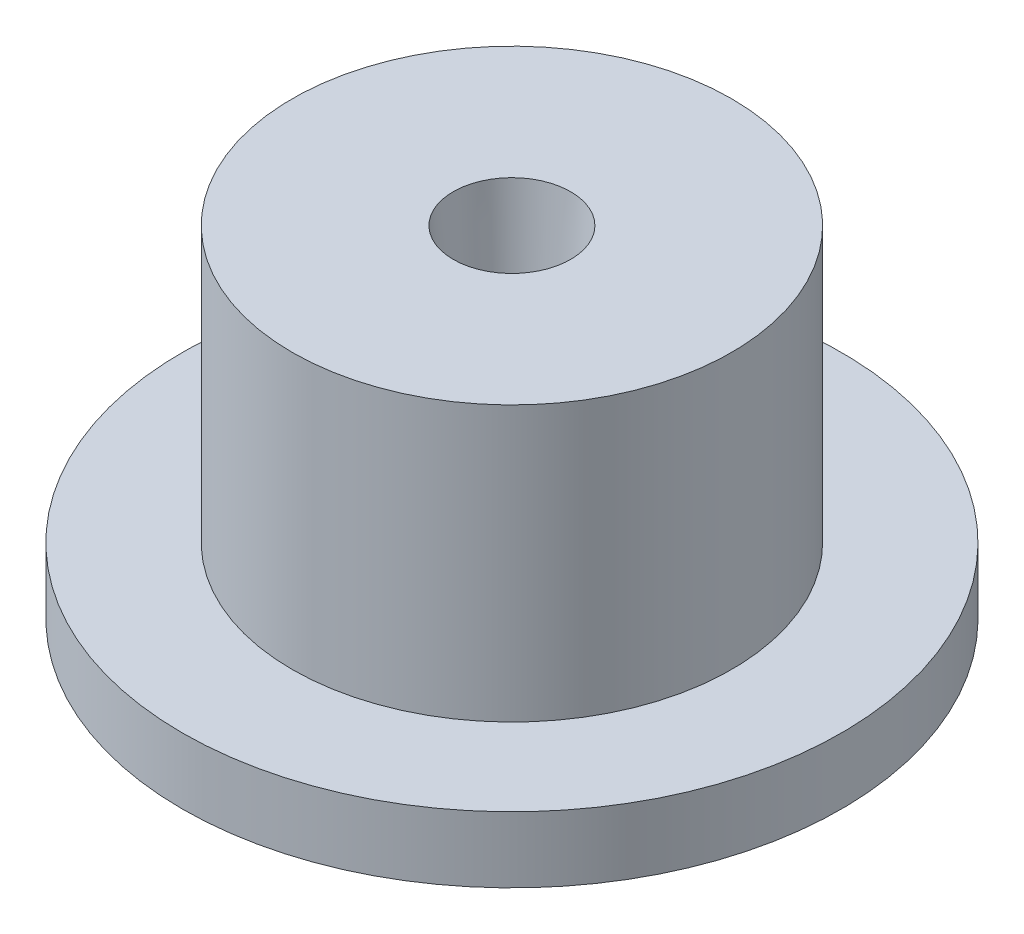
ISO-10303-21;
HEADER;
FILE_DESCRIPTION(('STEP AP214'),'2;1');
FILE_NAME('part.step','',(''),(''),'','','');
FILE_SCHEMA(('AUTOMOTIVE_DESIGN { 1 0 10303 214 1 1 1 1 }'));
ENDSEC;
DATA;
#1=APPLICATION_CONTEXT('core data for automotive mechanical design processes');
#2=APPLICATION_PROTOCOL_DEFINITION('international standard','automotive_design',2000,#1);
#3=PRODUCT_CONTEXT('',#1,'mechanical');
#4=PRODUCT('Part','Part','',(#3));
#5=PRODUCT_RELATED_PRODUCT_CATEGORY('part','',(#4));
#6=PRODUCT_DEFINITION_FORMATION('','',#4);
#7=PRODUCT_DEFINITION_CONTEXT('part definition',#1,'design');
#8=PRODUCT_DEFINITION('design','',#6,#7);
#9=PRODUCT_DEFINITION_SHAPE('','',#8);
#10=(LENGTH_UNIT() NAMED_UNIT(*) SI_UNIT(.MILLI.,.METRE.));
#11=(NAMED_UNIT(*) PLANE_ANGLE_UNIT() SI_UNIT($,.RADIAN.));
#12=(NAMED_UNIT(*) SI_UNIT($,.STERADIAN.) SOLID_ANGLE_UNIT());
#13=UNCERTAINTY_MEASURE_WITH_UNIT(LENGTH_MEASURE(1.E-05),#10,'distance_accuracy_value','');
#14=(GEOMETRIC_REPRESENTATION_CONTEXT(3) GLOBAL_UNCERTAINTY_ASSIGNED_CONTEXT((#13)) GLOBAL_UNIT_ASSIGNED_CONTEXT((#10,
#11,#12)) REPRESENTATION_CONTEXT('',''));
#15=CARTESIAN_POINT('',(0.,0.,0.));
#16=DIRECTION('',(0.,0.,1.));
#17=DIRECTION('',(1.,0.,0.));
#18=AXIS2_PLACEMENT_3D('',#15,#16,#17);
#19=CARTESIAN_POINT('',(0.,20.6666666666667,0.));
#20=DIRECTION('',(0.,1.,0.));
#21=DIRECTION('',(0.,0.,1.));
#22=AXIS2_PLACEMENT_3D('',#19,#20,#21);
#23=CYLINDRICAL_SURFACE('',#22,6.);
#24=CARTESIAN_POINT('',(0.,1.2,0.));
#25=DIRECTION('',(0.,1.,0.));
#26=DIRECTION('',(0.,0.,1.));
#27=AXIS2_PLACEMENT_3D('',#24,#25,#26);
#28=CIRCLE('',#27,6.);
#29=CARTESIAN_POINT('',(0.,1.2,6.));
#30=VERTEX_POINT('',#29);
#31=EDGE_CURVE('E10',#30,#30,#28,.T.);
#32=ORIENTED_EDGE('',*,*,#31,.F.);
#33=EDGE_LOOP('',(#32));
#34=FACE_BOUND('',#33,.T.);
#35=CARTESIAN_POINT('',(0.,0.,0.));
#36=DIRECTION('',(0.,1.,0.));
#37=DIRECTION('',(0.,0.,1.));
#38=AXIS2_PLACEMENT_3D('',#35,#36,#37);
#39=CIRCLE('',#38,6.);
#40=CARTESIAN_POINT('',(0.,0.,6.));
#41=VERTEX_POINT('',#40);
#42=EDGE_CURVE('E53',#41,#41,#39,.T.);
#43=ORIENTED_EDGE('',*,*,#42,.T.);
#44=EDGE_LOOP('',(#43));
#45=FACE_BOUND('',#44,.T.);
#46=ADVANCED_FACE('F31',(#34,#45),#23,.T.);
#47=CARTESIAN_POINT('',(6.,1.2,0.));
#48=DIRECTION('',(0.,-1.,0.));
#49=DIRECTION('',(0.,0.,-1.));
#50=AXIS2_PLACEMENT_3D('',#47,#48,#49);
#51=PLANE('',#50);
#52=CARTESIAN_POINT('',(0.,1.2,0.));
#53=DIRECTION('',(0.,1.,0.));
#54=DIRECTION('',(0.,0.,1.));
#55=AXIS2_PLACEMENT_3D('',#52,#53,#54);
#56=CIRCLE('',#55,4.);
#57=CARTESIAN_POINT('',(0.,1.2,4.));
#58=VERTEX_POINT('',#57);
#59=EDGE_CURVE('E37',#58,#58,#56,.T.);
#60=ORIENTED_EDGE('',*,*,#59,.F.);
#61=EDGE_LOOP('',(#60));
#62=FACE_BOUND('',#61,.T.);
#63=ORIENTED_EDGE('',*,*,#31,.T.);
#64=EDGE_LOOP('',(#63));
#65=FACE_BOUND('',#64,.T.);
#66=ADVANCED_FACE('F78',(#62,#65),#51,.F.);
#67=CARTESIAN_POINT('',(0.,20.6666666666667,0.));
#68=DIRECTION('',(0.,1.,0.));
#69=DIRECTION('',(0.,0.,1.));
#70=AXIS2_PLACEMENT_3D('',#67,#68,#69);
#71=CYLINDRICAL_SURFACE('',#70,4.);
#72=CARTESIAN_POINT('',(0.,6.2,0.));
#73=DIRECTION('',(0.,1.,0.));
#74=DIRECTION('',(0.,0.,1.));
#75=AXIS2_PLACEMENT_3D('',#72,#73,#74);
#76=CIRCLE('',#75,4.);
#77=CARTESIAN_POINT('',(0.,6.2,4.));
#78=VERTEX_POINT('',#77);
#79=EDGE_CURVE('E41',#78,#78,#76,.T.);
#80=ORIENTED_EDGE('',*,*,#79,.F.);
#81=EDGE_LOOP('',(#80));
#82=FACE_BOUND('',#81,.T.);
#83=ORIENTED_EDGE('',*,*,#59,.T.);
#84=EDGE_LOOP('',(#83));
#85=FACE_BOUND('',#84,.T.);
#86=ADVANCED_FACE('F73',(#82,#85),#71,.T.);
#87=CARTESIAN_POINT('',(4.,6.2,0.));
#88=DIRECTION('',(0.,-1.,0.));
#89=DIRECTION('',(0.,0.,-1.));
#90=AXIS2_PLACEMENT_3D('',#87,#88,#89);
#91=PLANE('',#90);
#92=CARTESIAN_POINT('',(0.,6.2,0.));
#93=DIRECTION('',(0.,1.,0.));
#94=DIRECTION('',(0.,0.,1.));
#95=AXIS2_PLACEMENT_3D('',#92,#93,#94);
#96=CIRCLE('',#95,1.06874062519177);
#97=CARTESIAN_POINT('',(0.,6.2,1.06874062519177));
#98=VERTEX_POINT('',#97);
#99=EDGE_CURVE('E45',#98,#98,#96,.T.);
#100=ORIENTED_EDGE('',*,*,#99,.F.);
#101=EDGE_LOOP('',(#100));
#102=FACE_BOUND('',#101,.T.);
#103=ORIENTED_EDGE('',*,*,#79,.T.);
#104=EDGE_LOOP('',(#103));
#105=FACE_BOUND('',#104,.T.);
#106=ADVANCED_FACE('F67',(#102,#105),#91,.F.);
#107=CARTESIAN_POINT('',(0.,6.2,0.));
#108=DIRECTION('',(0.,1.,0.));
#109=DIRECTION('',(0.,0.,1.));
#110=AXIS2_PLACEMENT_3D('',#107,#108,#109);
#111=CONICAL_SURFACE('',#110,1.06874062519177,0.0689771033897694);
#112=CARTESIAN_POINT('',(0.,0.,0.));
#113=DIRECTION('',(0.,1.,0.));
#114=DIRECTION('',(0.,0.,1.));
#115=AXIS2_PLACEMENT_3D('',#112,#113,#114);
#116=CIRCLE('',#115,0.640403047938266);
#117=CARTESIAN_POINT('',(0.,0.,0.640403047938266));
#118=VERTEX_POINT('',#117);
#119=EDGE_CURVE('E50',#118,#118,#116,.T.);
#120=ORIENTED_EDGE('',*,*,#119,.F.);
#121=EDGE_LOOP('',(#120));
#122=FACE_BOUND('',#121,.T.);
#123=ORIENTED_EDGE('',*,*,#99,.T.);
#124=EDGE_LOOP('',(#123));
#125=FACE_BOUND('',#124,.T.);
#126=ADVANCED_FACE('F61',(#122,#125),#111,.F.);
#127=CARTESIAN_POINT('',(0.640403047938266,0.,0.));
#128=DIRECTION('',(0.,1.,0.));
#129=DIRECTION('',(0.,0.,1.));
#130=AXIS2_PLACEMENT_3D('',#127,#128,#129);
#131=PLANE('',#130);
#132=ORIENTED_EDGE('',*,*,#42,.F.);
#133=EDGE_LOOP('',(#132));
#134=FACE_BOUND('',#133,.T.);
#135=ORIENTED_EDGE('',*,*,#119,.T.);
#136=EDGE_LOOP('',(#135));
#137=FACE_BOUND('',#136,.T.);
#138=ADVANCED_FACE('F58',(#134,#137),#131,.F.);
#139=CLOSED_SHELL('',(#46,#66,#86,#106,#126,#138));
#140=MANIFOLD_SOLID_BREP('B2',#139);
#141=ADVANCED_BREP_SHAPE_REPRESENTATION('',(#18,#140),#14);
#142=SHAPE_DEFINITION_REPRESENTATION(#9,#141);
ENDSEC;
END-ISO-10303-21;
